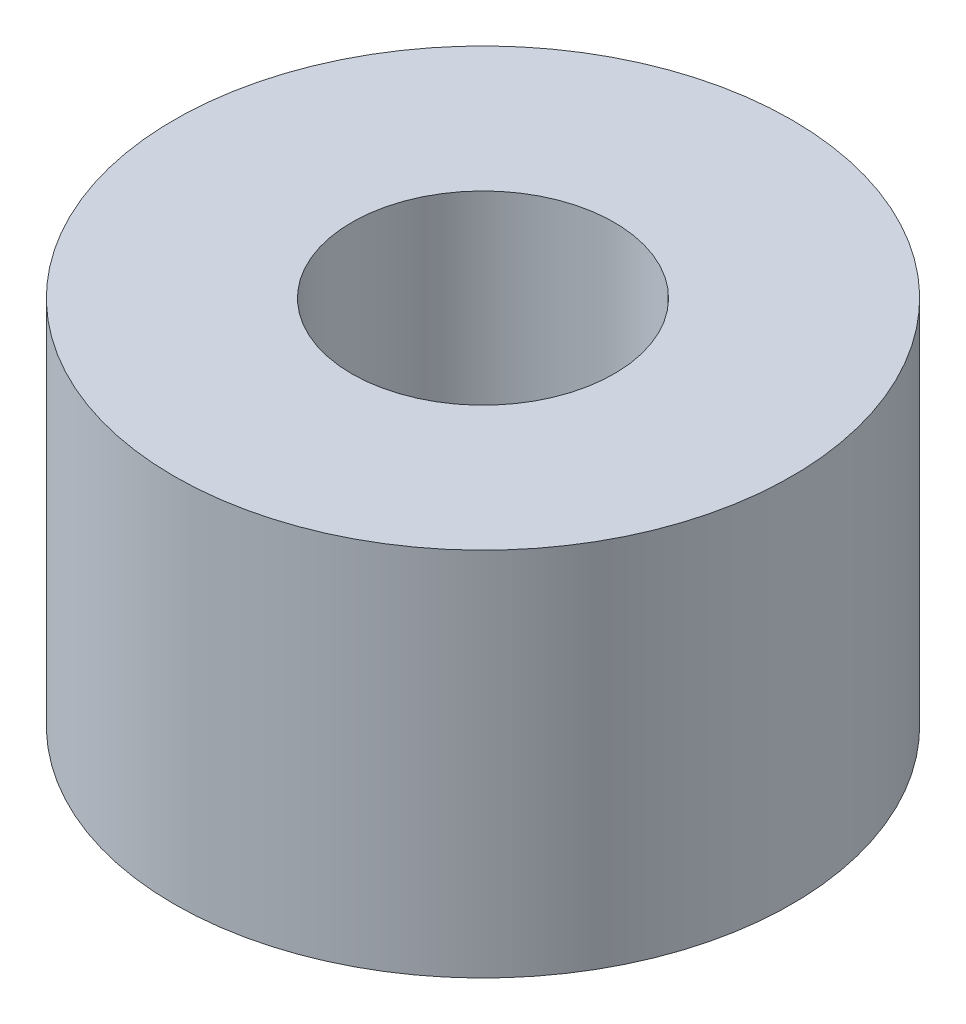
ISO-10303-21;
HEADER;
FILE_DESCRIPTION(('STEP AP214'),'2;1');
FILE_NAME('part.step','',(''),(''),'','','');
FILE_SCHEMA(('AUTOMOTIVE_DESIGN { 1 0 10303 214 1 1 1 1 }'));
ENDSEC;
DATA;
#1=APPLICATION_CONTEXT('core data for automotive mechanical design processes');
#2=APPLICATION_PROTOCOL_DEFINITION('international standard','automotive_design',2000,#1);
#3=PRODUCT_CONTEXT('',#1,'mechanical');
#4=PRODUCT('Part','Part','',(#3));
#5=PRODUCT_RELATED_PRODUCT_CATEGORY('part','',(#4));
#6=PRODUCT_DEFINITION_FORMATION('','',#4);
#7=PRODUCT_DEFINITION_CONTEXT('part definition',#1,'design');
#8=PRODUCT_DEFINITION('design','',#6,#7);
#9=PRODUCT_DEFINITION_SHAPE('','',#8);
#10=(LENGTH_UNIT() NAMED_UNIT(*) SI_UNIT(.MILLI.,.METRE.));
#11=(NAMED_UNIT(*) PLANE_ANGLE_UNIT() SI_UNIT($,.RADIAN.));
#12=(NAMED_UNIT(*) SI_UNIT($,.STERADIAN.) SOLID_ANGLE_UNIT());
#13=UNCERTAINTY_MEASURE_WITH_UNIT(LENGTH_MEASURE(1.E-05),#10,'distance_accuracy_value','');
#14=(GEOMETRIC_REPRESENTATION_CONTEXT(3) GLOBAL_UNCERTAINTY_ASSIGNED_CONTEXT((#13)) GLOBAL_UNIT_ASSIGNED_CONTEXT((#10,
#11,#12)) REPRESENTATION_CONTEXT('',''));
#15=CARTESIAN_POINT('',(0.,0.,0.));
#16=DIRECTION('',(0.,0.,1.));
#17=DIRECTION('',(1.,0.,0.));
#18=AXIS2_PLACEMENT_3D('',#15,#16,#17);
#19=CARTESIAN_POINT('',(0.,6.,0.));
#20=DIRECTION('',(0.,1.,0.));
#21=DIRECTION('',(0.,0.,1.));
#22=AXIS2_PLACEMENT_3D('',#19,#20,#21);
#23=PLANE('',#22);
#24=CARTESIAN_POINT('',(0.,6.,0.));
#25=DIRECTION('',(0.,1.,0.));
#26=DIRECTION('',(0.,0.,1.));
#27=AXIS2_PLACEMENT_3D('',#24,#25,#26);
#28=CIRCLE('',#27,5.);
#29=CARTESIAN_POINT('',(0.,6.,5.));
#30=VERTEX_POINT('',#29);
#31=EDGE_CURVE('E10',#30,#30,#28,.T.);
#32=ORIENTED_EDGE('',*,*,#31,.T.);
#33=EDGE_LOOP('',(#32));
#34=FACE_BOUND('',#33,.T.);
#35=CARTESIAN_POINT('',(0.,6.,0.));
#36=DIRECTION('',(0.,1.,0.));
#37=DIRECTION('',(0.,0.,1.));
#38=AXIS2_PLACEMENT_3D('',#35,#36,#37);
#39=CIRCLE('',#38,2.125);
#40=CARTESIAN_POINT('',(0.,6.,2.125));
#41=VERTEX_POINT('',#40);
#42=EDGE_CURVE('E48',#41,#41,#39,.T.);
#43=ORIENTED_EDGE('',*,*,#42,.F.);
#44=EDGE_LOOP('',(#43));
#45=FACE_BOUND('',#44,.T.);
#46=ADVANCED_FACE('F37',(#34,#45),#23,.T.);
#47=CARTESIAN_POINT('',(0.,0.,0.));
#48=DIRECTION('',(0.,1.,0.));
#49=DIRECTION('',(0.,0.,1.));
#50=AXIS2_PLACEMENT_3D('',#47,#48,#49);
#51=PLANE('',#50);
#52=CARTESIAN_POINT('',(0.,0.,0.));
#53=DIRECTION('',(0.,1.,0.));
#54=DIRECTION('',(0.,0.,1.));
#55=AXIS2_PLACEMENT_3D('',#52,#53,#54);
#56=CIRCLE('',#55,5.);
#57=CARTESIAN_POINT('',(0.,0.,5.));
#58=VERTEX_POINT('',#57);
#59=EDGE_CURVE('E41',#58,#58,#56,.T.);
#60=ORIENTED_EDGE('',*,*,#59,.F.);
#61=EDGE_LOOP('',(#60));
#62=FACE_BOUND('',#61,.T.);
#63=CARTESIAN_POINT('',(0.,0.,0.));
#64=DIRECTION('',(0.,1.,0.));
#65=DIRECTION('',(0.,0.,1.));
#66=AXIS2_PLACEMENT_3D('',#63,#64,#65);
#67=CIRCLE('',#66,2.125);
#68=CARTESIAN_POINT('',(0.,0.,2.125));
#69=VERTEX_POINT('',#68);
#70=EDGE_CURVE('E50',#69,#69,#67,.T.);
#71=ORIENTED_EDGE('',*,*,#70,.T.);
#72=EDGE_LOOP('',(#71));
#73=FACE_BOUND('',#72,.T.);
#74=ADVANCED_FACE('F60',(#62,#73),#51,.F.);
#75=CARTESIAN_POINT('',(0.,6.,0.));
#76=DIRECTION('',(0.,-1.,0.));
#77=DIRECTION('',(0.,0.,-1.));
#78=AXIS2_PLACEMENT_3D('',#75,#76,#77);
#79=CYLINDRICAL_SURFACE('',#78,5.);
#80=ORIENTED_EDGE('',*,*,#31,.F.);
#81=EDGE_LOOP('',(#80));
#82=FACE_BOUND('',#81,.T.);
#83=ORIENTED_EDGE('',*,*,#59,.T.);
#84=EDGE_LOOP('',(#83));
#85=FACE_BOUND('',#84,.T.);
#86=ADVANCED_FACE('F39',(#82,#85),#79,.T.);
#87=CARTESIAN_POINT('',(0.,6.,0.));
#88=DIRECTION('',(0.,-1.,0.));
#89=DIRECTION('',(0.,0.,-1.));
#90=AXIS2_PLACEMENT_3D('',#87,#88,#89);
#91=CYLINDRICAL_SURFACE('',#90,2.125);
#92=ORIENTED_EDGE('',*,*,#42,.T.);
#93=EDGE_LOOP('',(#92));
#94=FACE_BOUND('',#93,.T.);
#95=ORIENTED_EDGE('',*,*,#70,.F.);
#96=EDGE_LOOP('',(#95));
#97=FACE_BOUND('',#96,.T.);
#98=ADVANCED_FACE('F56',(#94,#97),#91,.F.);
#99=CLOSED_SHELL('',(#46,#74,#86,#98));
#100=MANIFOLD_SOLID_BREP('B2',#99);
#101=ADVANCED_BREP_SHAPE_REPRESENTATION('',(#18,#100),#14);
#102=SHAPE_DEFINITION_REPRESENTATION(#9,#101);
ENDSEC;
END-ISO-10303-21;
